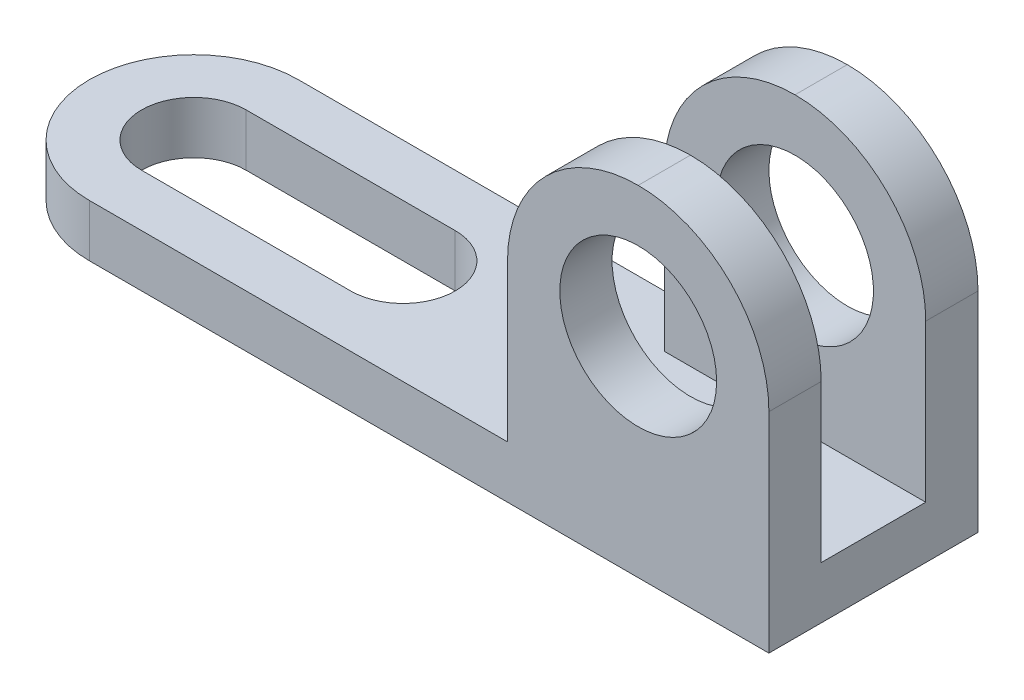
ISO-10303-21;
HEADER;
FILE_DESCRIPTION(('STEP AP214'),'2;1');
FILE_NAME('part.step','',(''),(''),'','','');
FILE_SCHEMA(('AUTOMOTIVE_DESIGN { 1 0 10303 214 1 1 1 1 }'));
ENDSEC;
DATA;
#1=APPLICATION_CONTEXT('core data for automotive mechanical design processes');
#2=APPLICATION_PROTOCOL_DEFINITION('international standard','automotive_design',2000,#1);
#3=PRODUCT_CONTEXT('',#1,'mechanical');
#4=PRODUCT('Part','Part','',(#3));
#5=PRODUCT_RELATED_PRODUCT_CATEGORY('part','',(#4));
#6=PRODUCT_DEFINITION_FORMATION('','',#4);
#7=PRODUCT_DEFINITION_CONTEXT('part definition',#1,'design');
#8=PRODUCT_DEFINITION('design','',#6,#7);
#9=PRODUCT_DEFINITION_SHAPE('','',#8);
#10=(LENGTH_UNIT() NAMED_UNIT(*) SI_UNIT(.MILLI.,.METRE.));
#11=(NAMED_UNIT(*) PLANE_ANGLE_UNIT() SI_UNIT($,.RADIAN.));
#12=(NAMED_UNIT(*) SI_UNIT($,.STERADIAN.) SOLID_ANGLE_UNIT());
#13=UNCERTAINTY_MEASURE_WITH_UNIT(LENGTH_MEASURE(1.E-05),#10,'distance_accuracy_value','');
#14=(GEOMETRIC_REPRESENTATION_CONTEXT(3) GLOBAL_UNCERTAINTY_ASSIGNED_CONTEXT((#13)) GLOBAL_UNIT_ASSIGNED_CONTEXT((#10,
#11,#12)) REPRESENTATION_CONTEXT('',''));
#15=CARTESIAN_POINT('',(0.,0.,0.));
#16=DIRECTION('',(0.,0.,1.));
#17=DIRECTION('',(1.,0.,0.));
#18=AXIS2_PLACEMENT_3D('',#15,#16,#17);
#19=CARTESIAN_POINT('',(75.,10.,-20.));
#20=DIRECTION('',(-1.,0.,0.));
#21=DIRECTION('',(0.,0.,1.));
#22=AXIS2_PLACEMENT_3D('',#19,#20,#21);
#23=PLANE('',#22);
#24=DIRECTION('',(0.,-1.,0.));
#25=VECTOR('',#24,1.);
#26=CARTESIAN_POINT('',(75.,10.,-20.));
#27=LINE('',#26,#25);
#28=CARTESIAN_POINT('',(75.,40.,-20.));
#29=VERTEX_POINT('',#28);
#30=CARTESIAN_POINT('',(75.,0.,-20.));
#31=VERTEX_POINT('',#30);
#32=EDGE_CURVE('E249',#29,#31,#27,.T.);
#33=ORIENTED_EDGE('',*,*,#32,.F.);
#34=DIRECTION('',(0.,0.,1.));
#35=VECTOR('',#34,1.);
#36=CARTESIAN_POINT('',(75.,40.,-10.));
#37=LINE('',#36,#35);
#38=CARTESIAN_POINT('',(75.,40.,-10.));
#39=VERTEX_POINT('',#38);
#40=EDGE_CURVE('E264',#29,#39,#37,.T.);
#41=ORIENTED_EDGE('',*,*,#40,.T.);
#42=DIRECTION('',(0.,-1.,0.));
#43=VECTOR('',#42,1.);
#44=CARTESIAN_POINT('',(75.,65.,-10.));
#45=LINE('',#44,#43);
#46=CARTESIAN_POINT('',(75.,10.,-10.));
#47=VERTEX_POINT('',#46);
#48=EDGE_CURVE('E204',#39,#47,#45,.T.);
#49=ORIENTED_EDGE('',*,*,#48,.T.);
#50=DIRECTION('',(0.,0.,-1.));
#51=VECTOR('',#50,1.);
#52=CARTESIAN_POINT('',(75.,10.,-20.));
#53=LINE('',#52,#51);
#54=CARTESIAN_POINT('',(75.,10.,10.));
#55=VERTEX_POINT('',#54);
#56=EDGE_CURVE('E231',#55,#47,#53,.T.);
#57=ORIENTED_EDGE('',*,*,#56,.F.);
#58=DIRECTION('',(0.,-1.,0.));
#59=VECTOR('',#58,1.);
#60=CARTESIAN_POINT('',(75.,65.,10.));
#61=LINE('',#60,#59);
#62=CARTESIAN_POINT('',(75.,40.,10.));
#63=VERTEX_POINT('',#62);
#64=EDGE_CURVE('E228',#63,#55,#61,.T.);
#65=ORIENTED_EDGE('',*,*,#64,.F.);
#66=DIRECTION('',(0.,0.,-1.));
#67=VECTOR('',#66,1.);
#68=CARTESIAN_POINT('',(75.,40.,20.));
#69=LINE('',#68,#67);
#70=CARTESIAN_POINT('',(75.,40.,20.));
#71=VERTEX_POINT('',#70);
#72=EDGE_CURVE('E255',#63,#71,#69,.F.);
#73=ORIENTED_EDGE('',*,*,#72,.T.);
#74=DIRECTION('',(0.,-1.,0.));
#75=VECTOR('',#74,1.);
#76=CARTESIAN_POINT('',(75.,10.,20.));
#77=LINE('',#76,#75);
#78=CARTESIAN_POINT('',(75.,0.,20.));
#79=VERTEX_POINT('',#78);
#80=EDGE_CURVE('E240',#71,#79,#77,.T.);
#81=ORIENTED_EDGE('',*,*,#80,.T.);
#82=DIRECTION('',(0.,0.,-1.));
#83=VECTOR('',#82,1.);
#84=CARTESIAN_POINT('',(75.,0.,-20.));
#85=LINE('',#84,#83);
#86=EDGE_CURVE('E230',#79,#31,#85,.T.);
#87=ORIENTED_EDGE('',*,*,#86,.T.);
#88=EDGE_LOOP('',(#33,#41,#49,#57,#65,#73,#81,#87));
#89=FACE_BOUND('',#88,.T.);
#90=ADVANCED_FACE('F41',(#89),#23,.F.);
#91=CARTESIAN_POINT('',(-75.,10.,-20.));
#92=DIRECTION('',(0.,0.,1.));
#93=DIRECTION('',(1.,0.,0.));
#94=AXIS2_PLACEMENT_3D('',#91,#92,#93);
#95=PLANE('',#94);
#96=CARTESIAN_POINT('',(50.,40.,-20.));
#97=DIRECTION('',(0.,0.,1.));
#98=DIRECTION('',(1.,0.,0.));
#99=AXIS2_PLACEMENT_3D('',#96,#97,#98);
#100=CIRCLE('',#99,15.);
#101=CARTESIAN_POINT('',(65.,40.,-20.));
#102=VERTEX_POINT('',#101);
#103=EDGE_CURVE('E191',#102,#102,#100,.T.);
#104=ORIENTED_EDGE('',*,*,#103,.T.);
#105=EDGE_LOOP('',(#104));
#106=FACE_BOUND('',#105,.T.);
#107=DIRECTION('',(-1.,0.,0.));
#108=VECTOR('',#107,1.);
#109=CARTESIAN_POINT('',(-75.,0.,-20.));
#110=LINE('',#109,#108);
#111=CARTESIAN_POINT('',(-55.,0.,-20.));
#112=VERTEX_POINT('',#111);
#113=EDGE_CURVE('E243',#31,#112,#110,.T.);
#114=ORIENTED_EDGE('',*,*,#113,.T.);
#115=DIRECTION('',(0.,-1.,0.));
#116=VECTOR('',#115,1.);
#117=CARTESIAN_POINT('',(-55.,10.,-20.));
#118=LINE('',#117,#116);
#119=CARTESIAN_POINT('',(-55.,10.,-20.));
#120=VERTEX_POINT('',#119);
#121=EDGE_CURVE('E11',#112,#120,#118,.F.);
#122=ORIENTED_EDGE('',*,*,#121,.T.);
#123=DIRECTION('',(-1.,0.,0.));
#124=VECTOR('',#123,1.);
#125=CARTESIAN_POINT('',(-75.,10.,-20.));
#126=LINE('',#125,#124);
#127=CARTESIAN_POINT('',(25.,10.,-20.));
#128=VERTEX_POINT('',#127);
#129=EDGE_CURVE('E234',#128,#120,#126,.T.);
#130=ORIENTED_EDGE('',*,*,#129,.F.);
#131=DIRECTION('',(0.,-1.,0.));
#132=VECTOR('',#131,1.);
#133=CARTESIAN_POINT('',(25.,65.,-20.));
#134=LINE('',#133,#132);
#135=CARTESIAN_POINT('',(25.,40.,-20.));
#136=VERTEX_POINT('',#135);
#137=EDGE_CURVE('E208',#136,#128,#134,.T.);
#138=ORIENTED_EDGE('',*,*,#137,.F.);
#139=CARTESIAN_POINT('',(50.,40.,-20.));
#140=DIRECTION('',(0.,0.,1.));
#141=DIRECTION('',(1.,0.,0.));
#142=AXIS2_PLACEMENT_3D('',#139,#140,#141);
#143=CIRCLE('',#142,25.);
#144=CARTESIAN_POINT('',(50.,65.,-20.));
#145=VERTEX_POINT('',#144);
#146=EDGE_CURVE('E273',#136,#145,#143,.F.);
#147=ORIENTED_EDGE('',*,*,#146,.T.);
#148=CARTESIAN_POINT('',(50.,40.,-20.));
#149=DIRECTION('',(0.,0.,1.));
#150=DIRECTION('',(1.,0.,0.));
#151=AXIS2_PLACEMENT_3D('',#148,#149,#150);
#152=CIRCLE('',#151,25.);
#153=EDGE_CURVE('E275',#145,#29,#152,.F.);
#154=ORIENTED_EDGE('',*,*,#153,.T.);
#155=ORIENTED_EDGE('',*,*,#32,.T.);
#156=EDGE_LOOP('',(#114,#122,#130,#138,#147,#154,#155));
#157=FACE_BOUND('',#156,.T.);
#158=ADVANCED_FACE('F312',(#106,#157),#95,.F.);
#159=CARTESIAN_POINT('',(-75.,10.,20.));
#160=DIRECTION('',(0.,0.,-1.));
#161=DIRECTION('',(-1.,0.,0.));
#162=AXIS2_PLACEMENT_3D('',#159,#160,#161);
#163=PLANE('',#162);
#164=CARTESIAN_POINT('',(50.,40.,20.));
#165=DIRECTION('',(0.,0.,1.));
#166=DIRECTION('',(1.,0.,0.));
#167=AXIS2_PLACEMENT_3D('',#164,#165,#166);
#168=CIRCLE('',#167,15.);
#169=CARTESIAN_POINT('',(65.,40.,20.));
#170=VERTEX_POINT('',#169);
#171=EDGE_CURVE('E211',#170,#170,#168,.T.);
#172=ORIENTED_EDGE('',*,*,#171,.F.);
#173=EDGE_LOOP('',(#172));
#174=FACE_BOUND('',#173,.T.);
#175=DIRECTION('',(1.,0.,0.));
#176=VECTOR('',#175,1.);
#177=CARTESIAN_POINT('',(-75.,10.,20.));
#178=LINE('',#177,#176);
#179=CARTESIAN_POINT('',(-55.,10.,20.));
#180=VERTEX_POINT('',#179);
#181=CARTESIAN_POINT('',(25.,10.,20.));
#182=VERTEX_POINT('',#181);
#183=EDGE_CURVE('E238',#180,#182,#178,.T.);
#184=ORIENTED_EDGE('',*,*,#183,.F.);
#185=DIRECTION('',(0.,-1.,0.));
#186=VECTOR('',#185,1.);
#187=CARTESIAN_POINT('',(-55.,0.,20.));
#188=LINE('',#187,#186);
#189=CARTESIAN_POINT('',(-55.,0.,20.));
#190=VERTEX_POINT('',#189);
#191=EDGE_CURVE('E279',#180,#190,#188,.T.);
#192=ORIENTED_EDGE('',*,*,#191,.T.);
#193=DIRECTION('',(1.,0.,0.));
#194=VECTOR('',#193,1.);
#195=CARTESIAN_POINT('',(-75.,0.,20.));
#196=LINE('',#195,#194);
#197=EDGE_CURVE('E235',#190,#79,#196,.T.);
#198=ORIENTED_EDGE('',*,*,#197,.T.);
#199=ORIENTED_EDGE('',*,*,#80,.F.);
#200=CARTESIAN_POINT('',(50.,40.,20.));
#201=DIRECTION('',(0.,0.,-1.));
#202=DIRECTION('',(-1.,0.,0.));
#203=AXIS2_PLACEMENT_3D('',#200,#201,#202);
#204=CIRCLE('',#203,25.);
#205=CARTESIAN_POINT('',(50.,65.,20.));
#206=VERTEX_POINT('',#205);
#207=EDGE_CURVE('E260',#71,#206,#204,.F.);
#208=ORIENTED_EDGE('',*,*,#207,.T.);
#209=CARTESIAN_POINT('',(50.,40.,20.));
#210=DIRECTION('',(0.,0.,-1.));
#211=DIRECTION('',(-1.,0.,0.));
#212=AXIS2_PLACEMENT_3D('',#209,#210,#211);
#213=CIRCLE('',#212,25.);
#214=CARTESIAN_POINT('',(25.,40.,20.));
#215=VERTEX_POINT('',#214);
#216=EDGE_CURVE('E258',#206,#215,#213,.F.);
#217=ORIENTED_EDGE('',*,*,#216,.T.);
#218=DIRECTION('',(0.,-1.,0.));
#219=VECTOR('',#218,1.);
#220=CARTESIAN_POINT('',(25.,65.,20.));
#221=LINE('',#220,#219);
#222=EDGE_CURVE('E223',#215,#182,#221,.T.);
#223=ORIENTED_EDGE('',*,*,#222,.T.);
#224=EDGE_LOOP('',(#184,#192,#198,#199,#208,#217,#223));
#225=FACE_BOUND('',#224,.T.);
#226=ADVANCED_FACE('F299',(#174,#225),#163,.F.);
#227=CARTESIAN_POINT('',(0.,10.,0.));
#228=DIRECTION('',(0.,1.,0.));
#229=DIRECTION('',(0.,0.,1.));
#230=AXIS2_PLACEMENT_3D('',#227,#228,#229);
#231=PLANE('',#230);
#232=CARTESIAN_POINT('',(-55.,10.,0.));
#233=DIRECTION('',(0.,1.,0.));
#234=DIRECTION('',(0.,0.,1.));
#235=AXIS2_PLACEMENT_3D('',#232,#233,#234);
#236=CIRCLE('',#235,10.);
#237=CARTESIAN_POINT('',(-55.,10.,-10.));
#238=VERTEX_POINT('',#237);
#239=CARTESIAN_POINT('',(-55.,10.,10.));
#240=VERTEX_POINT('',#239);
#241=EDGE_CURVE('E57',#238,#240,#236,.T.);
#242=ORIENTED_EDGE('',*,*,#241,.F.);
#243=DIRECTION('',(-1.,0.,0.));
#244=VECTOR('',#243,1.);
#245=CARTESIAN_POINT('',(-55.,10.,-10.));
#246=LINE('',#245,#244);
#247=CARTESIAN_POINT('',(-15.,10.,-10.));
#248=VERTEX_POINT('',#247);
#249=EDGE_CURVE('E179',#248,#238,#246,.T.);
#250=ORIENTED_EDGE('',*,*,#249,.F.);
#251=CARTESIAN_POINT('',(-15.,10.,0.));
#252=DIRECTION('',(0.,1.,0.));
#253=DIRECTION('',(0.,0.,1.));
#254=AXIS2_PLACEMENT_3D('',#251,#252,#253);
#255=CIRCLE('',#254,10.);
#256=CARTESIAN_POINT('',(-15.,10.,10.));
#257=VERTEX_POINT('',#256);
#258=EDGE_CURVE('E163',#257,#248,#255,.T.);
#259=ORIENTED_EDGE('',*,*,#258,.F.);
#260=DIRECTION('',(1.,0.,0.));
#261=VECTOR('',#260,1.);
#262=CARTESIAN_POINT('',(-55.,10.,10.));
#263=LINE('',#262,#261);
#264=EDGE_CURVE('E172',#240,#257,#263,.T.);
#265=ORIENTED_EDGE('',*,*,#264,.F.);
#266=EDGE_LOOP('',(#242,#250,#259,#265));
#267=FACE_BOUND('',#266,.T.);
#268=CARTESIAN_POINT('',(-55.,10.,0.));
#269=DIRECTION('',(0.,1.,0.));
#270=DIRECTION('',(0.,0.,1.));
#271=AXIS2_PLACEMENT_3D('',#268,#269,#270);
#272=CIRCLE('',#271,20.);
#273=CARTESIAN_POINT('',(-75.,10.,0.));
#274=VERTEX_POINT('',#273);
#275=EDGE_CURVE('E288',#120,#274,#272,.T.);
#276=ORIENTED_EDGE('',*,*,#275,.T.);
#277=CARTESIAN_POINT('',(-55.,10.,0.));
#278=DIRECTION('',(0.,1.,0.));
#279=DIRECTION('',(0.,0.,1.));
#280=AXIS2_PLACEMENT_3D('',#277,#278,#279);
#281=CIRCLE('',#280,20.);
#282=EDGE_CURVE('E50',#274,#180,#281,.T.);
#283=ORIENTED_EDGE('',*,*,#282,.T.);
#284=ORIENTED_EDGE('',*,*,#183,.T.);
#285=DIRECTION('',(0.,0.,1.));
#286=VECTOR('',#285,1.);
#287=CARTESIAN_POINT('',(25.,10.,20.));
#288=LINE('',#287,#286);
#289=CARTESIAN_POINT('',(25.,10.,10.));
#290=VERTEX_POINT('',#289);
#291=EDGE_CURVE('E220',#290,#182,#288,.T.);
#292=ORIENTED_EDGE('',*,*,#291,.F.);
#293=DIRECTION('',(-1.,0.,0.));
#294=VECTOR('',#293,1.);
#295=CARTESIAN_POINT('',(75.,10.,10.));
#296=LINE('',#295,#294);
#297=EDGE_CURVE('E217',#55,#290,#296,.T.);
#298=ORIENTED_EDGE('',*,*,#297,.F.);
#299=ORIENTED_EDGE('',*,*,#56,.T.);
#300=DIRECTION('',(-1.,0.,0.));
#301=VECTOR('',#300,1.);
#302=CARTESIAN_POINT('',(75.,10.,-10.));
#303=LINE('',#302,#301);
#304=CARTESIAN_POINT('',(25.,10.,-10.));
#305=VERTEX_POINT('',#304);
#306=EDGE_CURVE('E201',#47,#305,#303,.T.);
#307=ORIENTED_EDGE('',*,*,#306,.T.);
#308=DIRECTION('',(0.,0.,-1.));
#309=VECTOR('',#308,1.);
#310=CARTESIAN_POINT('',(25.,10.,-20.));
#311=LINE('',#310,#309);
#312=EDGE_CURVE('E198',#305,#128,#311,.T.);
#313=ORIENTED_EDGE('',*,*,#312,.T.);
#314=ORIENTED_EDGE('',*,*,#129,.T.);
#315=EDGE_LOOP('',(#276,#283,#284,#292,#298,#299,#307,#313,#314));
#316=FACE_BOUND('',#315,.T.);
#317=ADVANCED_FACE('F176',(#267,#316),#231,.T.);
#318=CARTESIAN_POINT('',(0.,0.,0.));
#319=DIRECTION('',(0.,1.,0.));
#320=DIRECTION('',(0.,0.,1.));
#321=AXIS2_PLACEMENT_3D('',#318,#319,#320);
#322=PLANE('',#321);
#323=DIRECTION('',(1.,0.,0.));
#324=VECTOR('',#323,1.);
#325=CARTESIAN_POINT('',(-55.,0.,-10.));
#326=LINE('',#325,#324);
#327=CARTESIAN_POINT('',(-55.,0.,-10.));
#328=VERTEX_POINT('',#327);
#329=CARTESIAN_POINT('',(-15.,0.,-10.));
#330=VERTEX_POINT('',#329);
#331=EDGE_CURVE('E406',#328,#330,#326,.T.);
#332=ORIENTED_EDGE('',*,*,#331,.F.);
#333=CARTESIAN_POINT('',(-55.,0.,0.));
#334=DIRECTION('',(0.,1.,0.));
#335=DIRECTION('',(0.,0.,1.));
#336=AXIS2_PLACEMENT_3D('',#333,#334,#335);
#337=CIRCLE('',#336,10.);
#338=CARTESIAN_POINT('',(-55.,0.,10.));
#339=VERTEX_POINT('',#338);
#340=EDGE_CURVE('E190',#339,#328,#337,.F.);
#341=ORIENTED_EDGE('',*,*,#340,.F.);
#342=DIRECTION('',(-1.,0.,0.));
#343=VECTOR('',#342,1.);
#344=CARTESIAN_POINT('',(-55.,0.,10.));
#345=LINE('',#344,#343);
#346=CARTESIAN_POINT('',(-15.,0.,10.));
#347=VERTEX_POINT('',#346);
#348=EDGE_CURVE('E188',#347,#339,#345,.T.);
#349=ORIENTED_EDGE('',*,*,#348,.F.);
#350=CARTESIAN_POINT('',(-15.,0.,0.));
#351=DIRECTION('',(0.,1.,0.));
#352=DIRECTION('',(0.,0.,1.));
#353=AXIS2_PLACEMENT_3D('',#350,#351,#352);
#354=CIRCLE('',#353,10.);
#355=EDGE_CURVE('E166',#330,#347,#354,.F.);
#356=ORIENTED_EDGE('',*,*,#355,.F.);
#357=EDGE_LOOP('',(#332,#341,#349,#356));
#358=FACE_BOUND('',#357,.T.);
#359=ORIENTED_EDGE('',*,*,#197,.F.);
#360=CARTESIAN_POINT('',(-55.,0.,0.));
#361=DIRECTION('',(0.,1.,0.));
#362=DIRECTION('',(0.,0.,1.));
#363=AXIS2_PLACEMENT_3D('',#360,#361,#362);
#364=CIRCLE('',#363,20.);
#365=CARTESIAN_POINT('',(-75.,0.,0.));
#366=VERTEX_POINT('',#365);
#367=EDGE_CURVE('E286',#190,#366,#364,.F.);
#368=ORIENTED_EDGE('',*,*,#367,.T.);
#369=CARTESIAN_POINT('',(-55.,0.,0.));
#370=DIRECTION('',(0.,1.,0.));
#371=DIRECTION('',(0.,0.,1.));
#372=AXIS2_PLACEMENT_3D('',#369,#370,#371);
#373=CIRCLE('',#372,20.);
#374=EDGE_CURVE('E284',#366,#112,#373,.F.);
#375=ORIENTED_EDGE('',*,*,#374,.T.);
#376=ORIENTED_EDGE('',*,*,#113,.F.);
#377=ORIENTED_EDGE('',*,*,#86,.F.);
#378=EDGE_LOOP('',(#359,#368,#375,#376,#377));
#379=FACE_BOUND('',#378,.T.);
#380=ADVANCED_FACE('F305',(#358,#379),#322,.F.);
#381=CARTESIAN_POINT('',(75.,65.,10.));
#382=DIRECTION('',(0.,0.,1.));
#383=DIRECTION('',(1.,0.,0.));
#384=AXIS2_PLACEMENT_3D('',#381,#382,#383);
#385=PLANE('',#384);
#386=CARTESIAN_POINT('',(50.,40.,10.));
#387=DIRECTION('',(0.,0.,1.));
#388=DIRECTION('',(1.,0.,0.));
#389=AXIS2_PLACEMENT_3D('',#386,#387,#388);
#390=CIRCLE('',#389,15.);
#391=CARTESIAN_POINT('',(65.,40.,10.));
#392=VERTEX_POINT('',#391);
#393=EDGE_CURVE('E214',#392,#392,#390,.F.);
#394=ORIENTED_EDGE('',*,*,#393,.F.);
#395=EDGE_LOOP('',(#394));
#396=FACE_BOUND('',#395,.T.);
#397=CARTESIAN_POINT('',(50.,40.,10.));
#398=DIRECTION('',(0.,0.,1.));
#399=DIRECTION('',(1.,0.,0.));
#400=AXIS2_PLACEMENT_3D('',#397,#398,#399);
#401=CIRCLE('',#400,25.);
#402=CARTESIAN_POINT('',(25.,40.,10.));
#403=VERTEX_POINT('',#402);
#404=CARTESIAN_POINT('',(50.,65.,10.));
#405=VERTEX_POINT('',#404);
#406=EDGE_CURVE('E251',#403,#405,#401,.F.);
#407=ORIENTED_EDGE('',*,*,#406,.T.);
#408=CARTESIAN_POINT('',(50.,40.,10.));
#409=DIRECTION('',(0.,0.,1.));
#410=DIRECTION('',(1.,0.,0.));
#411=AXIS2_PLACEMENT_3D('',#408,#409,#410);
#412=CIRCLE('',#411,25.);
#413=EDGE_CURVE('E253',#405,#63,#412,.F.);
#414=ORIENTED_EDGE('',*,*,#413,.T.);
#415=ORIENTED_EDGE('',*,*,#64,.T.);
#416=ORIENTED_EDGE('',*,*,#297,.T.);
#417=DIRECTION('',(0.,-1.,0.));
#418=VECTOR('',#417,1.);
#419=CARTESIAN_POINT('',(25.,65.,10.));
#420=LINE('',#419,#418);
#421=EDGE_CURVE('E226',#403,#290,#420,.T.);
#422=ORIENTED_EDGE('',*,*,#421,.F.);
#423=EDGE_LOOP('',(#407,#414,#415,#416,#422));
#424=FACE_BOUND('',#423,.T.);
#425=ADVANCED_FACE('F345',(#396,#424),#385,.F.);
#426=CARTESIAN_POINT('',(25.,65.,20.));
#427=DIRECTION('',(1.,0.,0.));
#428=DIRECTION('',(0.,0.,-1.));
#429=AXIS2_PLACEMENT_3D('',#426,#427,#428);
#430=PLANE('',#429);
#431=ORIENTED_EDGE('',*,*,#222,.F.);
#432=DIRECTION('',(0.,0.,1.));
#433=VECTOR('',#432,1.);
#434=CARTESIAN_POINT('',(25.,40.,10.));
#435=LINE('',#434,#433);
#436=EDGE_CURVE('E262',#215,#403,#435,.F.);
#437=ORIENTED_EDGE('',*,*,#436,.T.);
#438=ORIENTED_EDGE('',*,*,#421,.T.);
#439=ORIENTED_EDGE('',*,*,#291,.T.);
#440=EDGE_LOOP('',(#431,#437,#438,#439));
#441=FACE_BOUND('',#440,.T.);
#442=ADVANCED_FACE('F417',(#441),#430,.F.);
#443=CARTESIAN_POINT('',(50.,40.,-32.4264068711928));
#444=DIRECTION('',(0.,0.,1.));
#445=DIRECTION('',(1.,0.,0.));
#446=AXIS2_PLACEMENT_3D('',#443,#444,#445);
#447=CYLINDRICAL_SURFACE('',#446,15.);
#448=ORIENTED_EDGE('',*,*,#393,.T.);
#449=EDGE_LOOP('',(#448));
#450=FACE_BOUND('',#449,.T.);
#451=ORIENTED_EDGE('',*,*,#171,.T.);
#452=EDGE_LOOP('',(#451));
#453=FACE_BOUND('',#452,.T.);
#454=ADVANCED_FACE('F376',(#450,#453),#447,.F.);
#455=CARTESIAN_POINT('',(50.,40.,0.));
#456=DIRECTION('',(0.,0.,-1.));
#457=DIRECTION('',(-1.,0.,0.));
#458=AXIS2_PLACEMENT_3D('',#455,#456,#457);
#459=CYLINDRICAL_SURFACE('',#458,25.);
#460=ORIENTED_EDGE('',*,*,#436,.F.);
#461=ORIENTED_EDGE('',*,*,#216,.F.);
#462=DIRECTION('',(0.,0.,1.));
#463=VECTOR('',#462,1.);
#464=CARTESIAN_POINT('',(50.,65.,20.));
#465=LINE('',#464,#463);
#466=EDGE_CURVE('E210',#405,#206,#465,.T.);
#467=ORIENTED_EDGE('',*,*,#466,.F.);
#468=ORIENTED_EDGE('',*,*,#406,.F.);
#469=EDGE_LOOP('',(#460,#461,#467,#468));
#470=FACE_BOUND('',#469,.T.);
#471=ADVANCED_FACE('F340',(#470),#459,.T.);
#472=CARTESIAN_POINT('',(50.,40.,0.));
#473=DIRECTION('',(0.,0.,1.));
#474=DIRECTION('',(1.,0.,0.));
#475=AXIS2_PLACEMENT_3D('',#472,#473,#474);
#476=CYLINDRICAL_SURFACE('',#475,25.);
#477=ORIENTED_EDGE('',*,*,#207,.F.);
#478=ORIENTED_EDGE('',*,*,#72,.F.);
#479=ORIENTED_EDGE('',*,*,#413,.F.);
#480=ORIENTED_EDGE('',*,*,#466,.T.);
#481=EDGE_LOOP('',(#477,#478,#479,#480));
#482=FACE_BOUND('',#481,.T.);
#483=ADVANCED_FACE('F343',(#482),#476,.T.);
#484=CARTESIAN_POINT('',(25.,65.,-20.));
#485=DIRECTION('',(-1.,0.,0.));
#486=DIRECTION('',(0.,0.,1.));
#487=AXIS2_PLACEMENT_3D('',#484,#485,#486);
#488=PLANE('',#487);
#489=DIRECTION('',(0.,-1.,0.));
#490=VECTOR('',#489,1.);
#491=CARTESIAN_POINT('',(25.,65.,-10.));
#492=LINE('',#491,#490);
#493=CARTESIAN_POINT('',(25.,40.,-10.));
#494=VERTEX_POINT('',#493);
#495=EDGE_CURVE('E206',#494,#305,#492,.T.);
#496=ORIENTED_EDGE('',*,*,#495,.F.);
#497=DIRECTION('',(0.,0.,-1.));
#498=VECTOR('',#497,1.);
#499=CARTESIAN_POINT('',(25.,40.,-20.));
#500=LINE('',#499,#498);
#501=EDGE_CURVE('E277',#494,#136,#500,.T.);
#502=ORIENTED_EDGE('',*,*,#501,.T.);
#503=ORIENTED_EDGE('',*,*,#137,.T.);
#504=ORIENTED_EDGE('',*,*,#312,.F.);
#505=EDGE_LOOP('',(#496,#502,#503,#504));
#506=FACE_BOUND('',#505,.T.);
#507=ADVANCED_FACE('F318',(#506),#488,.T.);
#508=CARTESIAN_POINT('',(75.,65.,-10.));
#509=DIRECTION('',(0.,0.,1.));
#510=DIRECTION('',(1.,0.,0.));
#511=AXIS2_PLACEMENT_3D('',#508,#509,#510);
#512=PLANE('',#511);
#513=CARTESIAN_POINT('',(50.,40.,-10.));
#514=DIRECTION('',(0.,0.,-1.));
#515=DIRECTION('',(-1.,0.,0.));
#516=AXIS2_PLACEMENT_3D('',#513,#514,#515);
#517=CIRCLE('',#516,15.);
#518=CARTESIAN_POINT('',(35.,40.,-10.));
#519=VERTEX_POINT('',#518);
#520=EDGE_CURVE('E194',#519,#519,#517,.T.);
#521=ORIENTED_EDGE('',*,*,#520,.T.);
#522=EDGE_LOOP('',(#521));
#523=FACE_BOUND('',#522,.T.);
#524=ORIENTED_EDGE('',*,*,#48,.F.);
#525=CARTESIAN_POINT('',(50.,40.,-10.));
#526=DIRECTION('',(0.,0.,1.));
#527=DIRECTION('',(1.,0.,0.));
#528=AXIS2_PLACEMENT_3D('',#525,#526,#527);
#529=CIRCLE('',#528,25.);
#530=CARTESIAN_POINT('',(50.,65.,-10.));
#531=VERTEX_POINT('',#530);
#532=EDGE_CURVE('E271',#39,#531,#529,.T.);
#533=ORIENTED_EDGE('',*,*,#532,.T.);
#534=CARTESIAN_POINT('',(50.,40.,-10.));
#535=DIRECTION('',(0.,0.,1.));
#536=DIRECTION('',(1.,0.,0.));
#537=AXIS2_PLACEMENT_3D('',#534,#535,#536);
#538=CIRCLE('',#537,25.);
#539=EDGE_CURVE('E269',#531,#494,#538,.T.);
#540=ORIENTED_EDGE('',*,*,#539,.T.);
#541=ORIENTED_EDGE('',*,*,#495,.T.);
#542=ORIENTED_EDGE('',*,*,#306,.F.);
#543=EDGE_LOOP('',(#524,#533,#540,#541,#542));
#544=FACE_BOUND('',#543,.T.);
#545=ADVANCED_FACE('F350',(#523,#544),#512,.T.);
#546=CARTESIAN_POINT('',(50.,40.,-20.));
#547=DIRECTION('',(0.,0.,-1.));
#548=DIRECTION('',(-1.,0.,0.));
#549=AXIS2_PLACEMENT_3D('',#546,#547,#548);
#550=CYLINDRICAL_SURFACE('',#549,25.);
#551=DIRECTION('',(0.,0.,-1.));
#552=VECTOR('',#551,1.);
#553=CARTESIAN_POINT('',(50.,65.,0.));
#554=LINE('',#553,#552);
#555=EDGE_CURVE('E197',#145,#531,#554,.F.);
#556=ORIENTED_EDGE('',*,*,#555,.F.);
#557=ORIENTED_EDGE('',*,*,#146,.F.);
#558=ORIENTED_EDGE('',*,*,#501,.F.);
#559=ORIENTED_EDGE('',*,*,#539,.F.);
#560=EDGE_LOOP('',(#556,#557,#558,#559));
#561=FACE_BOUND('',#560,.T.);
#562=ADVANCED_FACE('F323',(#561),#550,.T.);
#563=CARTESIAN_POINT('',(50.,40.,-20.));
#564=DIRECTION('',(0.,0.,-1.));
#565=DIRECTION('',(-1.,0.,0.));
#566=AXIS2_PLACEMENT_3D('',#563,#564,#565);
#567=CYLINDRICAL_SURFACE('',#566,25.);
#568=ORIENTED_EDGE('',*,*,#153,.F.);
#569=ORIENTED_EDGE('',*,*,#555,.T.);
#570=ORIENTED_EDGE('',*,*,#532,.F.);
#571=ORIENTED_EDGE('',*,*,#40,.F.);
#572=EDGE_LOOP('',(#568,#569,#570,#571));
#573=FACE_BOUND('',#572,.T.);
#574=ADVANCED_FACE('F328',(#573),#567,.T.);
#575=CARTESIAN_POINT('',(50.,40.,52.4264068711928));
#576=DIRECTION('',(0.,0.,-1.));
#577=DIRECTION('',(-1.,0.,0.));
#578=AXIS2_PLACEMENT_3D('',#575,#576,#577);
#579=CYLINDRICAL_SURFACE('',#578,15.);
#580=ORIENTED_EDGE('',*,*,#520,.F.);
#581=EDGE_LOOP('',(#580));
#582=FACE_BOUND('',#581,.T.);
#583=ORIENTED_EDGE('',*,*,#103,.F.);
#584=EDGE_LOOP('',(#583));
#585=FACE_BOUND('',#584,.T.);
#586=ADVANCED_FACE('F377',(#582,#585),#579,.F.);
#587=CARTESIAN_POINT('',(-55.,10.,0.));
#588=DIRECTION('',(0.,1.,0.));
#589=DIRECTION('',(0.,0.,1.));
#590=AXIS2_PLACEMENT_3D('',#587,#588,#589);
#591=CYLINDRICAL_SURFACE('',#590,20.);
#592=DIRECTION('',(0.,-1.,0.));
#593=VECTOR('',#592,1.);
#594=CARTESIAN_POINT('',(-75.,0.,0.));
#595=LINE('',#594,#593);
#596=EDGE_CURVE('E45',#274,#366,#595,.T.);
#597=ORIENTED_EDGE('',*,*,#596,.F.);
#598=ORIENTED_EDGE('',*,*,#275,.F.);
#599=ORIENTED_EDGE('',*,*,#121,.F.);
#600=ORIENTED_EDGE('',*,*,#374,.F.);
#601=EDGE_LOOP('',(#597,#598,#599,#600));
#602=FACE_BOUND('',#601,.T.);
#603=ADVANCED_FACE('F43',(#602),#591,.T.);
#604=CARTESIAN_POINT('',(-55.,10.,0.));
#605=DIRECTION('',(0.,1.,0.));
#606=DIRECTION('',(0.,0.,1.));
#607=AXIS2_PLACEMENT_3D('',#604,#605,#606);
#608=CYLINDRICAL_SURFACE('',#607,20.);
#609=ORIENTED_EDGE('',*,*,#282,.F.);
#610=ORIENTED_EDGE('',*,*,#596,.T.);
#611=ORIENTED_EDGE('',*,*,#367,.F.);
#612=ORIENTED_EDGE('',*,*,#191,.F.);
#613=EDGE_LOOP('',(#609,#610,#611,#612));
#614=FACE_BOUND('',#613,.T.);
#615=ADVANCED_FACE('F302',(#614),#608,.T.);
#616=CARTESIAN_POINT('',(-55.,-63.2455532033676,0.));
#617=DIRECTION('',(0.,1.,0.));
#618=DIRECTION('',(0.,0.,1.));
#619=AXIS2_PLACEMENT_3D('',#616,#617,#618);
#620=CYLINDRICAL_SURFACE('',#619,10.);
#621=ORIENTED_EDGE('',*,*,#340,.T.);
#622=DIRECTION('',(0.,1.,0.));
#623=VECTOR('',#622,1.);
#624=CARTESIAN_POINT('',(-55.,-63.2455532033676,-10.));
#625=LINE('',#624,#623);
#626=EDGE_CURVE('E184',#328,#238,#625,.T.);
#627=ORIENTED_EDGE('',*,*,#626,.T.);
#628=ORIENTED_EDGE('',*,*,#241,.T.);
#629=DIRECTION('',(0.,1.,0.));
#630=VECTOR('',#629,1.);
#631=CARTESIAN_POINT('',(-55.,-63.2455532033676,10.));
#632=LINE('',#631,#630);
#633=EDGE_CURVE('E169',#339,#240,#632,.T.);
#634=ORIENTED_EDGE('',*,*,#633,.F.);
#635=EDGE_LOOP('',(#621,#627,#628,#634));
#636=FACE_BOUND('',#635,.T.);
#637=ADVANCED_FACE('F379',(#636),#620,.F.);
#638=CARTESIAN_POINT('',(-55.,-63.2455532033676,-10.));
#639=DIRECTION('',(0.,0.,-1.));
#640=DIRECTION('',(-1.,0.,0.));
#641=AXIS2_PLACEMENT_3D('',#638,#639,#640);
#642=PLANE('',#641);
#643=ORIENTED_EDGE('',*,*,#331,.T.);
#644=DIRECTION('',(0.,1.,0.));
#645=VECTOR('',#644,1.);
#646=CARTESIAN_POINT('',(-15.,-63.2455532033676,-10.));
#647=LINE('',#646,#645);
#648=EDGE_CURVE('E168',#330,#248,#647,.T.);
#649=ORIENTED_EDGE('',*,*,#648,.T.);
#650=ORIENTED_EDGE('',*,*,#249,.T.);
#651=ORIENTED_EDGE('',*,*,#626,.F.);
#652=EDGE_LOOP('',(#643,#649,#650,#651));
#653=FACE_BOUND('',#652,.T.);
#654=ADVANCED_FACE('F385',(#653),#642,.F.);
#655=CARTESIAN_POINT('',(-15.,-63.2455532033676,0.));
#656=DIRECTION('',(0.,1.,0.));
#657=DIRECTION('',(0.,0.,1.));
#658=AXIS2_PLACEMENT_3D('',#655,#656,#657);
#659=CYLINDRICAL_SURFACE('',#658,10.);
#660=ORIENTED_EDGE('',*,*,#355,.T.);
#661=DIRECTION('',(0.,1.,0.));
#662=VECTOR('',#661,1.);
#663=CARTESIAN_POINT('',(-15.,-63.2455532033676,10.));
#664=LINE('',#663,#662);
#665=EDGE_CURVE('E65',#347,#257,#664,.T.);
#666=ORIENTED_EDGE('',*,*,#665,.T.);
#667=ORIENTED_EDGE('',*,*,#258,.T.);
#668=ORIENTED_EDGE('',*,*,#648,.F.);
#669=EDGE_LOOP('',(#660,#666,#667,#668));
#670=FACE_BOUND('',#669,.T.);
#671=ADVANCED_FACE('F160',(#670),#659,.F.);
#672=CARTESIAN_POINT('',(-55.,-63.2455532033676,10.));
#673=DIRECTION('',(0.,0.,1.));
#674=DIRECTION('',(1.,0.,0.));
#675=AXIS2_PLACEMENT_3D('',#672,#673,#674);
#676=PLANE('',#675);
#677=ORIENTED_EDGE('',*,*,#348,.T.);
#678=ORIENTED_EDGE('',*,*,#633,.T.);
#679=ORIENTED_EDGE('',*,*,#264,.T.);
#680=ORIENTED_EDGE('',*,*,#665,.F.);
#681=EDGE_LOOP('',(#677,#678,#679,#680));
#682=FACE_BOUND('',#681,.T.);
#683=ADVANCED_FACE('F173',(#682),#676,.F.);
#684=CLOSED_SHELL('',(#90,#158,#226,#317,#380,#425,#442,#454,#471,#483,#507,#545,#562,#574,#586,
#603,#615,#637,#654,#671,#683));
#685=MANIFOLD_SOLID_BREP('B2',#684);
#686=ADVANCED_BREP_SHAPE_REPRESENTATION('',(#18,#685),#14);
#687=SHAPE_DEFINITION_REPRESENTATION(#9,#686);
ENDSEC;
END-ISO-10303-21;
